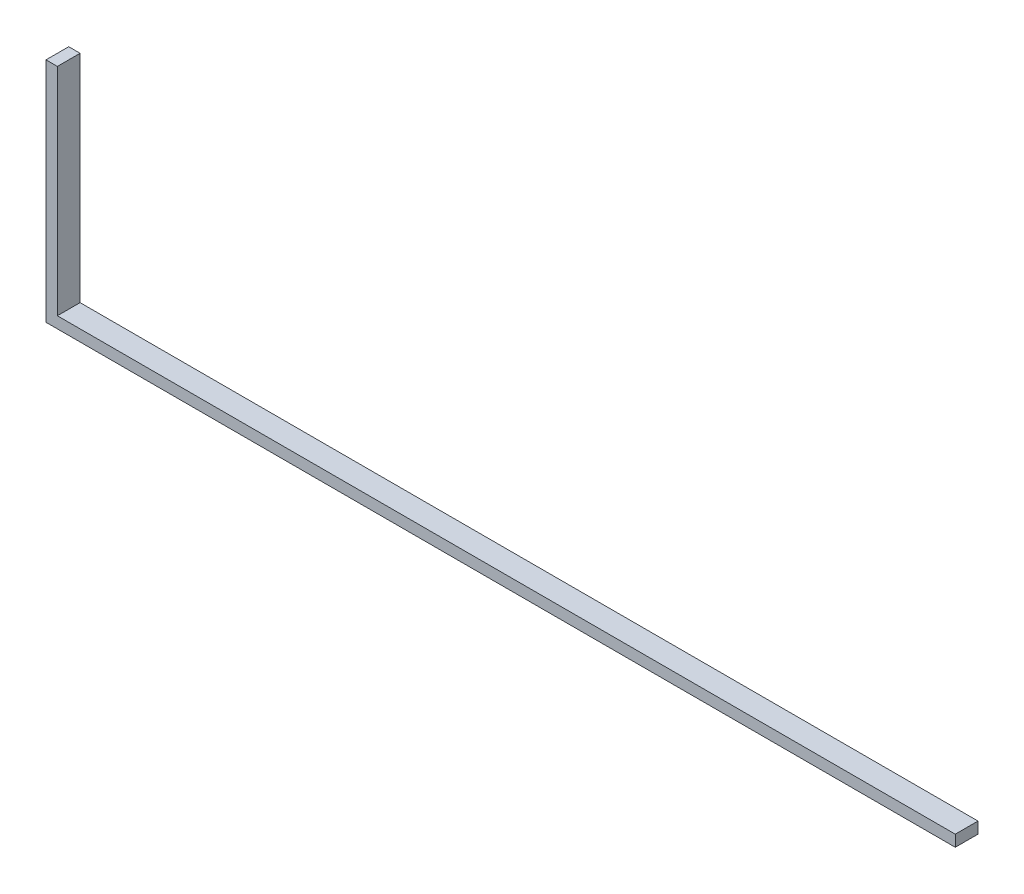
ISO-10303-21;
HEADER;
FILE_DESCRIPTION(('STEP AP214'),'2;1');
FILE_NAME('part.step','',(''),(''),'','','');
FILE_SCHEMA(('AUTOMOTIVE_DESIGN { 1 0 10303 214 1 1 1 1 }'));
ENDSEC;
DATA;
#1=APPLICATION_CONTEXT('core data for automotive mechanical design processes');
#2=APPLICATION_PROTOCOL_DEFINITION('international standard','automotive_design',2000,#1);
#3=PRODUCT_CONTEXT('',#1,'mechanical');
#4=PRODUCT('Part','Part','',(#3));
#5=PRODUCT_RELATED_PRODUCT_CATEGORY('part','',(#4));
#6=PRODUCT_DEFINITION_FORMATION('','',#4);
#7=PRODUCT_DEFINITION_CONTEXT('part definition',#1,'design');
#8=PRODUCT_DEFINITION('design','',#6,#7);
#9=PRODUCT_DEFINITION_SHAPE('','',#8);
#10=(LENGTH_UNIT() NAMED_UNIT(*) SI_UNIT(.MILLI.,.METRE.));
#11=(NAMED_UNIT(*) PLANE_ANGLE_UNIT() SI_UNIT($,.RADIAN.));
#12=(NAMED_UNIT(*) SI_UNIT($,.STERADIAN.) SOLID_ANGLE_UNIT());
#13=UNCERTAINTY_MEASURE_WITH_UNIT(LENGTH_MEASURE(1.E-05),#10,'distance_accuracy_value','');
#14=(GEOMETRIC_REPRESENTATION_CONTEXT(3) GLOBAL_UNCERTAINTY_ASSIGNED_CONTEXT((#13)) GLOBAL_UNIT_ASSIGNED_CONTEXT((#10,
#11,#12)) REPRESENTATION_CONTEXT('',''));
#15=CARTESIAN_POINT('',(0.,0.,0.));
#16=DIRECTION('',(0.,0.,1.));
#17=DIRECTION('',(1.,0.,0.));
#18=AXIS2_PLACEMENT_3D('',#15,#16,#17);
#19=CARTESIAN_POINT('',(50.,1000.,100.));
#20=DIRECTION('',(0.,-1.,0.));
#21=DIRECTION('',(0.,0.,-1.));
#22=AXIS2_PLACEMENT_3D('',#19,#20,#21);
#23=PLANE('',#22);
#24=DIRECTION('',(-1.,0.,0.));
#25=VECTOR('',#24,1.);
#26=CARTESIAN_POINT('',(50.,1000.,0.));
#27=LINE('',#26,#25);
#28=CARTESIAN_POINT('',(50.,1000.,0.));
#29=VERTEX_POINT('',#28);
#30=CARTESIAN_POINT('',(-1.10927217964873E-13,1000.,0.));
#31=VERTEX_POINT('',#30);
#32=EDGE_CURVE('E132',#29,#31,#27,.T.);
#33=ORIENTED_EDGE('',*,*,#32,.T.);
#34=DIRECTION('',(0.,0.,-1.));
#35=VECTOR('',#34,1.);
#36=CARTESIAN_POINT('',(-1.10927217964873E-13,1000.,100.));
#37=LINE('',#36,#35);
#38=CARTESIAN_POINT('',(-1.10927217964873E-13,1000.,100.));
#39=VERTEX_POINT('',#38);
#40=EDGE_CURVE('E11',#39,#31,#37,.T.);
#41=ORIENTED_EDGE('',*,*,#40,.F.);
#42=DIRECTION('',(-1.,0.,0.));
#43=VECTOR('',#42,1.);
#44=CARTESIAN_POINT('',(50.,1000.,100.));
#45=LINE('',#44,#43);
#46=CARTESIAN_POINT('',(50.,1000.,100.));
#47=VERTEX_POINT('',#46);
#48=EDGE_CURVE('E148',#47,#39,#45,.T.);
#49=ORIENTED_EDGE('',*,*,#48,.F.);
#50=DIRECTION('',(0.,0.,-1.));
#51=VECTOR('',#50,1.);
#52=CARTESIAN_POINT('',(50.,1000.,100.));
#53=LINE('',#52,#51);
#54=EDGE_CURVE('E128',#47,#29,#53,.T.);
#55=ORIENTED_EDGE('',*,*,#54,.T.);
#56=EDGE_LOOP('',(#33,#41,#49,#55));
#57=FACE_BOUND('',#56,.T.);
#58=ADVANCED_FACE('F43',(#57),#23,.F.);
#59=CARTESIAN_POINT('',(-1.10927217964873E-13,1000.,100.));
#60=DIRECTION('',(1.,0.,0.));
#61=DIRECTION('',(0.,1.,0.));
#62=AXIS2_PLACEMENT_3D('',#59,#60,#61);
#63=PLANE('',#62);
#64=DIRECTION('',(0.,-1.,0.));
#65=VECTOR('',#64,1.);
#66=CARTESIAN_POINT('',(-1.10927217964873E-13,1000.,0.));
#67=LINE('',#66,#65);
#68=CARTESIAN_POINT('',(0.,0.,0.));
#69=VERTEX_POINT('',#68);
#70=EDGE_CURVE('E136',#31,#69,#67,.T.);
#71=ORIENTED_EDGE('',*,*,#70,.T.);
#72=DIRECTION('',(0.,0.,-1.));
#73=VECTOR('',#72,1.);
#74=CARTESIAN_POINT('',(0.,0.,100.));
#75=LINE('',#74,#73);
#76=CARTESIAN_POINT('',(0.,0.,100.));
#77=VERTEX_POINT('',#76);
#78=EDGE_CURVE('E52',#77,#69,#75,.T.);
#79=ORIENTED_EDGE('',*,*,#78,.F.);
#80=DIRECTION('',(0.,-1.,0.));
#81=VECTOR('',#80,1.);
#82=CARTESIAN_POINT('',(-1.10927217964873E-13,1000.,100.));
#83=LINE('',#82,#81);
#84=EDGE_CURVE('E97',#39,#77,#83,.T.);
#85=ORIENTED_EDGE('',*,*,#84,.F.);
#86=ORIENTED_EDGE('',*,*,#40,.T.);
#87=EDGE_LOOP('',(#71,#79,#85,#86));
#88=FACE_BOUND('',#87,.T.);
#89=ADVANCED_FACE('F176',(#88),#63,.F.);
#90=CARTESIAN_POINT('',(0.,0.,100.));
#91=DIRECTION('',(0.,1.,0.));
#92=DIRECTION('',(0.,0.,1.));
#93=AXIS2_PLACEMENT_3D('',#90,#91,#92);
#94=PLANE('',#93);
#95=DIRECTION('',(1.,0.,0.));
#96=VECTOR('',#95,1.);
#97=CARTESIAN_POINT('',(0.,0.,0.));
#98=LINE('',#97,#96);
#99=CARTESIAN_POINT('',(4000.,0.,0.));
#100=VERTEX_POINT('',#99);
#101=EDGE_CURVE('E139',#69,#100,#98,.T.);
#102=ORIENTED_EDGE('',*,*,#101,.T.);
#103=DIRECTION('',(0.,0.,-1.));
#104=VECTOR('',#103,1.);
#105=CARTESIAN_POINT('',(4000.,0.,100.));
#106=LINE('',#105,#104);
#107=CARTESIAN_POINT('',(4000.,0.,100.));
#108=VERTEX_POINT('',#107);
#109=EDGE_CURVE('E121',#108,#100,#106,.T.);
#110=ORIENTED_EDGE('',*,*,#109,.F.);
#111=DIRECTION('',(1.,0.,0.));
#112=VECTOR('',#111,1.);
#113=CARTESIAN_POINT('',(0.,0.,100.));
#114=LINE('',#113,#112);
#115=EDGE_CURVE('E110',#77,#108,#114,.T.);
#116=ORIENTED_EDGE('',*,*,#115,.F.);
#117=ORIENTED_EDGE('',*,*,#78,.T.);
#118=EDGE_LOOP('',(#102,#110,#116,#117));
#119=FACE_BOUND('',#118,.T.);
#120=ADVANCED_FACE('F158',(#119),#94,.F.);
#121=CARTESIAN_POINT('',(4000.,0.,100.));
#122=DIRECTION('',(-1.,0.,0.));
#123=DIRECTION('',(0.,0.,1.));
#124=AXIS2_PLACEMENT_3D('',#121,#122,#123);
#125=PLANE('',#124);
#126=DIRECTION('',(0.,1.,0.));
#127=VECTOR('',#126,1.);
#128=CARTESIAN_POINT('',(4000.,0.,0.));
#129=LINE('',#128,#127);
#130=CARTESIAN_POINT('',(4000.,50.,0.));
#131=VERTEX_POINT('',#130);
#132=EDGE_CURVE('E119',#100,#131,#129,.T.);
#133=ORIENTED_EDGE('',*,*,#132,.T.);
#134=DIRECTION('',(0.,0.,-1.));
#135=VECTOR('',#134,1.);
#136=CARTESIAN_POINT('',(4000.,50.,100.));
#137=LINE('',#136,#135);
#138=CARTESIAN_POINT('',(4000.,50.,100.));
#139=VERTEX_POINT('',#138);
#140=EDGE_CURVE('E116',#139,#131,#137,.T.);
#141=ORIENTED_EDGE('',*,*,#140,.F.);
#142=DIRECTION('',(0.,1.,0.));
#143=VECTOR('',#142,1.);
#144=CARTESIAN_POINT('',(4000.,0.,100.));
#145=LINE('',#144,#143);
#146=EDGE_CURVE('E104',#108,#139,#145,.T.);
#147=ORIENTED_EDGE('',*,*,#146,.F.);
#148=ORIENTED_EDGE('',*,*,#109,.T.);
#149=EDGE_LOOP('',(#133,#141,#147,#148));
#150=FACE_BOUND('',#149,.T.);
#151=ADVANCED_FACE('F117',(#150),#125,.F.);
#152=CARTESIAN_POINT('',(4000.,50.,100.));
#153=DIRECTION('',(0.,-1.,0.));
#154=DIRECTION('',(1.,0.,0.));
#155=AXIS2_PLACEMENT_3D('',#152,#153,#154);
#156=PLANE('',#155);
#157=DIRECTION('',(-1.,0.,0.));
#158=VECTOR('',#157,1.);
#159=CARTESIAN_POINT('',(4000.,50.,0.));
#160=LINE('',#159,#158);
#161=CARTESIAN_POINT('',(49.9999999999998,49.9999999999995,0.));
#162=VERTEX_POINT('',#161);
#163=EDGE_CURVE('E83',#131,#162,#160,.T.);
#164=ORIENTED_EDGE('',*,*,#163,.T.);
#165=DIRECTION('',(0.,0.,-1.));
#166=VECTOR('',#165,1.);
#167=CARTESIAN_POINT('',(49.9999999999998,49.9999999999995,100.));
#168=LINE('',#167,#166);
#169=CARTESIAN_POINT('',(49.9999999999998,49.9999999999995,100.));
#170=VERTEX_POINT('',#169);
#171=EDGE_CURVE('E122',#170,#162,#168,.T.);
#172=ORIENTED_EDGE('',*,*,#171,.F.);
#173=DIRECTION('',(-1.,0.,0.));
#174=VECTOR('',#173,1.);
#175=CARTESIAN_POINT('',(4000.,50.,100.));
#176=LINE('',#175,#174);
#177=EDGE_CURVE('E108',#139,#170,#176,.T.);
#178=ORIENTED_EDGE('',*,*,#177,.F.);
#179=ORIENTED_EDGE('',*,*,#140,.T.);
#180=EDGE_LOOP('',(#164,#172,#178,#179));
#181=FACE_BOUND('',#180,.T.);
#182=ADVANCED_FACE('F124',(#181),#156,.F.);
#183=CARTESIAN_POINT('',(49.9999999999998,49.9999999999995,100.));
#184=DIRECTION('',(-1.,0.,0.));
#185=DIRECTION('',(0.,-1.,0.));
#186=AXIS2_PLACEMENT_3D('',#183,#184,#185);
#187=PLANE('',#186);
#188=DIRECTION('',(0.,1.,0.));
#189=VECTOR('',#188,1.);
#190=CARTESIAN_POINT('',(49.9999999999998,49.9999999999995,0.));
#191=LINE('',#190,#189);
#192=EDGE_CURVE('E89',#162,#29,#191,.T.);
#193=ORIENTED_EDGE('',*,*,#192,.T.);
#194=ORIENTED_EDGE('',*,*,#54,.F.);
#195=DIRECTION('',(0.,1.,0.));
#196=VECTOR('',#195,1.);
#197=CARTESIAN_POINT('',(49.9999999999998,49.9999999999995,100.));
#198=LINE('',#197,#196);
#199=EDGE_CURVE('E60',#170,#47,#198,.T.);
#200=ORIENTED_EDGE('',*,*,#199,.F.);
#201=ORIENTED_EDGE('',*,*,#171,.T.);
#202=EDGE_LOOP('',(#193,#194,#200,#201));
#203=FACE_BOUND('',#202,.T.);
#204=ADVANCED_FACE('F165',(#203),#187,.F.);
#205=CARTESIAN_POINT('',(0.,0.,100.));
#206=DIRECTION('',(0.,0.,1.));
#207=DIRECTION('',(1.,0.,0.));
#208=AXIS2_PLACEMENT_3D('',#205,#206,#207);
#209=PLANE('',#208);
#210=ORIENTED_EDGE('',*,*,#48,.T.);
#211=ORIENTED_EDGE('',*,*,#84,.T.);
#212=ORIENTED_EDGE('',*,*,#115,.T.);
#213=ORIENTED_EDGE('',*,*,#146,.T.);
#214=ORIENTED_EDGE('',*,*,#177,.T.);
#215=ORIENTED_EDGE('',*,*,#199,.T.);
#216=EDGE_LOOP('',(#210,#211,#212,#213,#214,#215));
#217=FACE_BOUND('',#216,.T.);
#218=ADVANCED_FACE('F106',(#217),#209,.T.);
#219=CARTESIAN_POINT('',(0.,0.,0.));
#220=DIRECTION('',(0.,0.,1.));
#221=DIRECTION('',(1.,0.,0.));
#222=AXIS2_PLACEMENT_3D('',#219,#220,#221);
#223=PLANE('',#222);
#224=ORIENTED_EDGE('',*,*,#32,.F.);
#225=ORIENTED_EDGE('',*,*,#192,.F.);
#226=ORIENTED_EDGE('',*,*,#163,.F.);
#227=ORIENTED_EDGE('',*,*,#132,.F.);
#228=ORIENTED_EDGE('',*,*,#101,.F.);
#229=ORIENTED_EDGE('',*,*,#70,.F.);
#230=EDGE_LOOP('',(#224,#225,#226,#227,#228,#229));
#231=FACE_BOUND('',#230,.T.);
#232=ADVANCED_FACE('F161',(#231),#223,.F.);
#233=CLOSED_SHELL('',(#58,#89,#120,#151,#182,#204,#218,#232));
#234=MANIFOLD_SOLID_BREP('B2',#233);
#235=ADVANCED_BREP_SHAPE_REPRESENTATION('',(#18,#234),#14);
#236=SHAPE_DEFINITION_REPRESENTATION(#9,#235);
ENDSEC;
END-ISO-10303-21;
